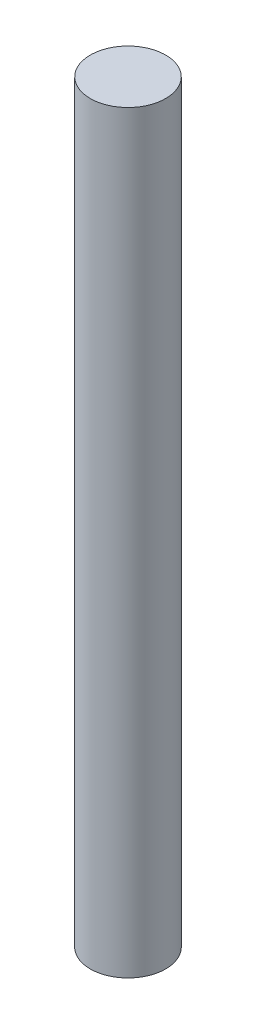
ISO-10303-21;
HEADER;
FILE_DESCRIPTION(('STEP AP214'),'2;1');
FILE_NAME('part.step','',(''),(''),'','','');
FILE_SCHEMA(('AUTOMOTIVE_DESIGN { 1 0 10303 214 1 1 1 1 }'));
ENDSEC;
DATA;
#1=APPLICATION_CONTEXT('core data for automotive mechanical design processes');
#2=APPLICATION_PROTOCOL_DEFINITION('international standard','automotive_design',2000,#1);
#3=PRODUCT_CONTEXT('',#1,'mechanical');
#4=PRODUCT('Part','Part','',(#3));
#5=PRODUCT_RELATED_PRODUCT_CATEGORY('part','',(#4));
#6=PRODUCT_DEFINITION_FORMATION('','',#4);
#7=PRODUCT_DEFINITION_CONTEXT('part definition',#1,'design');
#8=PRODUCT_DEFINITION('design','',#6,#7);
#9=PRODUCT_DEFINITION_SHAPE('','',#8);
#10=(LENGTH_UNIT() NAMED_UNIT(*) SI_UNIT(.MILLI.,.METRE.));
#11=(NAMED_UNIT(*) PLANE_ANGLE_UNIT() SI_UNIT($,.RADIAN.));
#12=(NAMED_UNIT(*) SI_UNIT($,.STERADIAN.) SOLID_ANGLE_UNIT());
#13=UNCERTAINTY_MEASURE_WITH_UNIT(LENGTH_MEASURE(1.E-05),#10,'distance_accuracy_value','');
#14=(GEOMETRIC_REPRESENTATION_CONTEXT(3) GLOBAL_UNCERTAINTY_ASSIGNED_CONTEXT((#13)) GLOBAL_UNIT_ASSIGNED_CONTEXT((#10,
#11,#12)) REPRESENTATION_CONTEXT('',''));
#15=CARTESIAN_POINT('',(0.,0.,0.));
#16=DIRECTION('',(0.,0.,1.));
#17=DIRECTION('',(1.,0.,0.));
#18=AXIS2_PLACEMENT_3D('',#15,#16,#17);
#19=CARTESIAN_POINT('',(0.,300.,0.));
#20=DIRECTION('',(0.,-1.,0.));
#21=DIRECTION('',(0.,0.,-1.));
#22=AXIS2_PLACEMENT_3D('',#19,#20,#21);
#23=CYLINDRICAL_SURFACE('',#22,15.);
#24=CARTESIAN_POINT('',(0.,300.,0.));
#25=DIRECTION('',(0.,1.,0.));
#26=DIRECTION('',(0.,0.,1.));
#27=AXIS2_PLACEMENT_3D('',#24,#25,#26);
#28=CIRCLE('',#27,15.);
#29=CARTESIAN_POINT('',(0.,300.,15.));
#30=VERTEX_POINT('',#29);
#31=EDGE_CURVE('E10',#30,#30,#28,.T.);
#32=ORIENTED_EDGE('',*,*,#31,.F.);
#33=EDGE_LOOP('',(#32));
#34=FACE_BOUND('',#33,.T.);
#35=CARTESIAN_POINT('',(0.,0.,0.));
#36=DIRECTION('',(0.,1.,0.));
#37=DIRECTION('',(0.,0.,1.));
#38=AXIS2_PLACEMENT_3D('',#35,#36,#37);
#39=CIRCLE('',#38,15.);
#40=CARTESIAN_POINT('',(0.,0.,15.));
#41=VERTEX_POINT('',#40);
#42=EDGE_CURVE('E35',#41,#41,#39,.T.);
#43=ORIENTED_EDGE('',*,*,#42,.T.);
#44=EDGE_LOOP('',(#43));
#45=FACE_BOUND('',#44,.T.);
#46=ADVANCED_FACE('F32',(#34,#45),#23,.T.);
#47=CARTESIAN_POINT('',(0.,300.,0.));
#48=DIRECTION('',(0.,1.,0.));
#49=DIRECTION('',(0.,0.,1.));
#50=AXIS2_PLACEMENT_3D('',#47,#48,#49);
#51=PLANE('',#50);
#52=ORIENTED_EDGE('',*,*,#31,.T.);
#53=EDGE_LOOP('',(#52));
#54=FACE_BOUND('',#53,.T.);
#55=ADVANCED_FACE('F52',(#54),#51,.T.);
#56=CARTESIAN_POINT('',(0.,0.,0.));
#57=DIRECTION('',(0.,1.,0.));
#58=DIRECTION('',(0.,0.,1.));
#59=AXIS2_PLACEMENT_3D('',#56,#57,#58);
#60=PLANE('',#59);
#61=ORIENTED_EDGE('',*,*,#42,.F.);
#62=EDGE_LOOP('',(#61));
#63=FACE_BOUND('',#62,.T.);
#64=ADVANCED_FACE('F50',(#63),#60,.F.);
#65=CLOSED_SHELL('',(#46,#55,#64));
#66=MANIFOLD_SOLID_BREP('B2',#65);
#67=ADVANCED_BREP_SHAPE_REPRESENTATION('',(#18,#66),#14);
#68=SHAPE_DEFINITION_REPRESENTATION(#9,#67);
ENDSEC;
END-ISO-10303-21;
